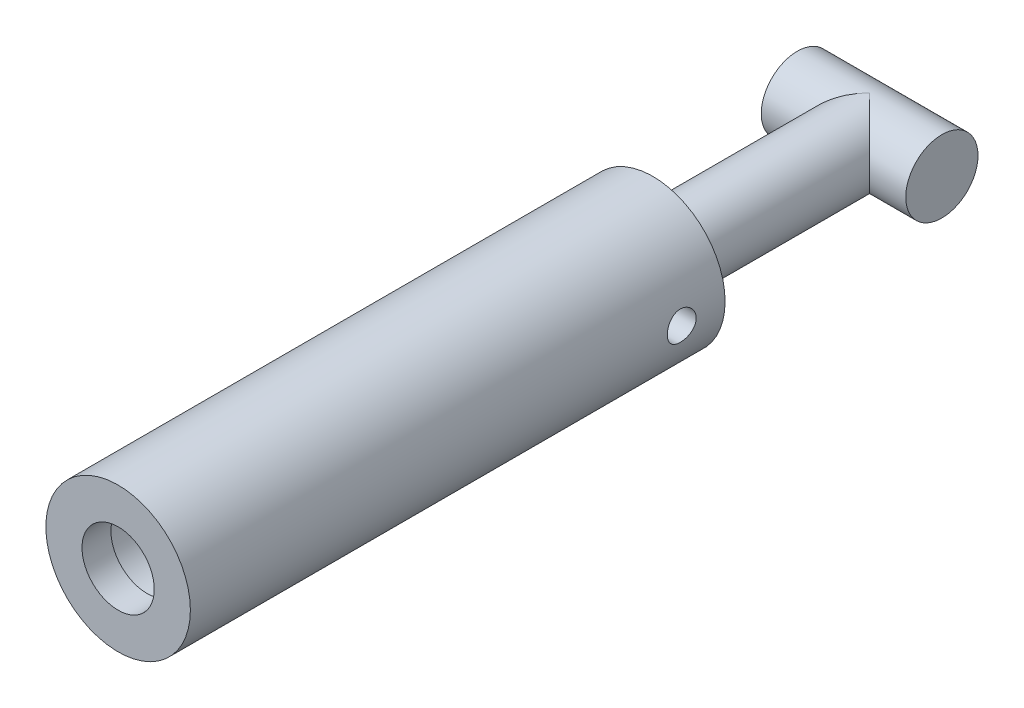
ISO-10303-21;
HEADER;
FILE_DESCRIPTION(('STEP AP214'),'2;1');
FILE_NAME('part.step','',(''),(''),'','','');
FILE_SCHEMA(('AUTOMOTIVE_DESIGN { 1 0 10303 214 1 1 1 1 }'));
ENDSEC;
DATA;
#1=APPLICATION_CONTEXT('core data for automotive mechanical design processes');
#2=APPLICATION_PROTOCOL_DEFINITION('international standard','automotive_design',2000,#1);
#3=PRODUCT_CONTEXT('',#1,'mechanical');
#4=PRODUCT('Part','Part','',(#3));
#5=PRODUCT_RELATED_PRODUCT_CATEGORY('part','',(#4));
#6=PRODUCT_DEFINITION_FORMATION('','',#4);
#7=PRODUCT_DEFINITION_CONTEXT('part definition',#1,'design');
#8=PRODUCT_DEFINITION('design','',#6,#7);
#9=PRODUCT_DEFINITION_SHAPE('','',#8);
#10=(LENGTH_UNIT() NAMED_UNIT(*) SI_UNIT(.MILLI.,.METRE.));
#11=(NAMED_UNIT(*) PLANE_ANGLE_UNIT() SI_UNIT($,.RADIAN.));
#12=(NAMED_UNIT(*) SI_UNIT($,.STERADIAN.) SOLID_ANGLE_UNIT());
#13=UNCERTAINTY_MEASURE_WITH_UNIT(LENGTH_MEASURE(1.E-05),#10,'distance_accuracy_value','');
#14=(GEOMETRIC_REPRESENTATION_CONTEXT(3) GLOBAL_UNCERTAINTY_ASSIGNED_CONTEXT((#13)) GLOBAL_UNIT_ASSIGNED_CONTEXT((#10,
#11,#12)) REPRESENTATION_CONTEXT('',''));
#15=CARTESIAN_POINT('',(0.,0.,0.));
#16=DIRECTION('',(0.,0.,1.));
#17=DIRECTION('',(1.,0.,0.));
#18=AXIS2_PLACEMENT_3D('',#15,#16,#17);
#19=CARTESIAN_POINT('',(0.,0.,0.));
#20=DIRECTION('',(0.,0.,1.));
#21=DIRECTION('',(1.,0.,0.));
#22=AXIS2_PLACEMENT_3D('',#19,#20,#21);
#23=PLANE('',#22);
#24=CARTESIAN_POINT('',(0.,0.,0.));
#25=DIRECTION('',(0.,0.,1.));
#26=DIRECTION('',(1.,0.,0.));
#27=AXIS2_PLACEMENT_3D('',#24,#25,#26);
#28=CIRCLE('',#27,5.);
#29=CARTESIAN_POINT('',(5.,0.,0.));
#30=VERTEX_POINT('',#29);
#31=EDGE_CURVE('E120',#30,#30,#28,.T.);
#32=ORIENTED_EDGE('',*,*,#31,.F.);
#33=EDGE_LOOP('',(#32));
#34=FACE_BOUND('',#33,.T.);
#35=CARTESIAN_POINT('',(0.,0.,0.));
#36=DIRECTION('',(0.,0.,1.));
#37=DIRECTION('',(1.,0.,0.));
#38=AXIS2_PLACEMENT_3D('',#35,#36,#37);
#39=CIRCLE('',#38,2.5);
#40=CARTESIAN_POINT('',(2.5,0.,0.));
#41=VERTEX_POINT('',#40);
#42=EDGE_CURVE('E12',#41,#41,#39,.F.);
#43=ORIENTED_EDGE('',*,*,#42,.F.);
#44=EDGE_LOOP('',(#43));
#45=FACE_BOUND('',#44,.T.);
#46=ADVANCED_FACE('F36',(#34,#45),#23,.F.);
#47=CARTESIAN_POINT('',(0.,0.,37.));
#48=DIRECTION('',(0.,0.,-1.));
#49=DIRECTION('',(-1.,0.,0.));
#50=AXIS2_PLACEMENT_3D('',#47,#48,#49);
#51=CYLINDRICAL_SURFACE('',#50,5.);
#52=CARTESIAN_POINT('',(-5.,0.,4.));
#53=CARTESIAN_POINT('',(-4.99999897580871,0.0555769067926332,3.99999795550165));
#54=CARTESIAN_POINT('',(-4.99906385178231,0.111179660201522,3.99535115703236));
#55=CARTESIAN_POINT('',(-4.99542365623231,0.220813507689019,3.97690149988476));
#56=CARTESIAN_POINT('',(-4.99271717860186,0.274843317541356,3.96309136719849));
#57=CARTESIAN_POINT('',(-4.98583649278287,0.379730305263313,3.92675872637921));
#58=CARTESIAN_POINT('',(-4.98166369076718,0.430590467933134,3.90424456315531));
#59=CARTESIAN_POINT('',(-4.97230398035314,0.527807988864226,3.85116775248871));
#60=CARTESIAN_POINT('',(-4.96711713235707,0.574165615075812,3.82060558439279));
#61=CARTESIAN_POINT('',(-4.9562216532997,0.661693477314865,3.75186150570857));
#62=CARTESIAN_POINT('',(-4.95050745504347,0.702793951158524,3.7135916446088));
#63=CARTESIAN_POINT('',(-4.93924180452588,0.778036756608028,3.6307075836083));
#64=CARTESIAN_POINT('',(-4.93369036500424,0.812178544770425,3.58609288866488));
#65=CARTESIAN_POINT('',(-4.92332441812615,0.87283175334762,3.49128380698812));
#66=CARTESIAN_POINT('',(-4.91851707364946,0.899270938865867,3.44104235620364));
#67=CARTESIAN_POINT('',(-4.91026268058418,0.943305666580308,3.33671818099592));
#68=CARTESIAN_POINT('',(-4.90681549761962,0.960902082437238,3.28263583665365));
#69=CARTESIAN_POINT('',(-4.90172805252204,0.986525299884828,3.17291563609208));
#70=CARTESIAN_POINT('',(-4.90006470107188,0.994674497958777,3.11730745585777));
#71=CARTESIAN_POINT('',(-4.89866375060627,1.00155212772612,3.00549017863566));
#72=CARTESIAN_POINT('',(-4.89892595467841,1.0002815227135,2.94928114367985));
#73=CARTESIAN_POINT('',(-4.90132551148185,0.988454573101819,2.838753211979));
#74=CARTESIAN_POINT('',(-4.90343452858763,0.978038540243906,2.78441859437269));
#75=CARTESIAN_POINT('',(-4.90924546160001,0.948437884623051,2.678283923337));
#76=CARTESIAN_POINT('',(-4.91294745357779,0.929252843100681,2.62648399108099));
#77=CARTESIAN_POINT('',(-4.92155618500408,0.88252478367472,2.5264847382964));
#78=CARTESIAN_POINT('',(-4.92647089813704,0.854926151232114,2.47831212043083));
#79=CARTESIAN_POINT('',(-4.93694618773062,0.792193574572679,2.38722915002719));
#80=CARTESIAN_POINT('',(-4.94250683838366,0.757058764356829,2.34431940314884));
#81=CARTESIAN_POINT('',(-4.95377021241462,0.679499934560584,2.26417059754306));
#82=CARTESIAN_POINT('',(-4.95947369210905,0.636956161212445,2.22704743214087));
#83=CARTESIAN_POINT('',(-4.97028848714408,0.54618502406201,2.16044615369878));
#84=CARTESIAN_POINT('',(-4.97539979488974,0.497957587379389,2.13096813870642));
#85=CARTESIAN_POINT('',(-4.98446690160887,0.397059386878921,2.08047249077402));
#86=CARTESIAN_POINT('',(-4.98842088848272,0.3443818195853,2.05946810635546));
#87=CARTESIAN_POINT('',(-4.99471408987858,0.236148976448665,2.02663952596143));
#88=CARTESIAN_POINT('',(-4.99705350000531,0.18059405007245,2.01481421792637));
#89=CARTESIAN_POINT('',(-4.99982671866868,0.0691794056271503,2.00084354620572));
#90=CARTESIAN_POINT('',(-5.0002917465247,0.0133403283255761,1.99853958045973));
#91=CARTESIAN_POINT('',(-4.99935051930103,-0.0979249341927142,2.00324985894218));
#92=CARTESIAN_POINT('',(-4.99794436941446,-0.153351142443793,2.0102635793526));
#93=CARTESIAN_POINT('',(-4.99343832008018,-0.261705659946541,2.03327837354396));
#94=CARTESIAN_POINT('',(-4.99035376404206,-0.314651948339903,2.0491980684979));
#95=CARTESIAN_POINT('',(-4.98283552061033,-0.417123627499667,2.08948398265581));
#96=CARTESIAN_POINT('',(-4.97840173214227,-0.46664876163754,2.11385083467683));
#97=CARTESIAN_POINT('',(-4.96859911533294,-0.561541173686218,2.17068249065131));
#98=CARTESIAN_POINT('',(-4.96321950437052,-0.606850126752188,2.20324278103895));
#99=CARTESIAN_POINT('',(-4.95214734829882,-0.691418019119207,2.27540919120728));
#100=CARTESIAN_POINT('',(-4.94645476968388,-0.730676308930763,2.31501606639987));
#101=CARTESIAN_POINT('',(-4.93529303556965,-0.802640590774176,2.40087335189112));
#102=CARTESIAN_POINT('',(-4.92982860233304,-0.835237702448655,2.44721574422134));
#103=CARTESIAN_POINT('',(-4.91984191796194,-0.892185420051206,2.54481136135668));
#104=CARTESIAN_POINT('',(-4.91531962913342,-0.916536355922903,2.59606438957355));
#105=CARTESIAN_POINT('',(-4.90776740584383,-0.95615184158196,2.70176824614955));
#106=CARTESIAN_POINT('',(-4.90472974872187,-0.971463499791051,2.75620084121032));
#107=CARTESIAN_POINT('',(-4.90047436792025,-0.992708651627196,2.8669334534909));
#108=CARTESIAN_POINT('',(-4.89925640691111,-0.998643368225113,2.92323322620935));
#109=CARTESIAN_POINT('',(-4.89879149631379,-1.00092091086747,3.03500886454432));
#110=CARTESIAN_POINT('',(-4.89950919189301,-0.997435788070896,3.09048114892701));
#111=CARTESIAN_POINT('',(-4.90275573484614,-0.981352304100061,3.20003164990503));
#112=CARTESIAN_POINT('',(-4.90528456767169,-0.968754016129298,3.2541098776948));
#113=CARTESIAN_POINT('',(-4.91185264219159,-0.934878568498954,3.35922771124054));
#114=CARTESIAN_POINT('',(-4.91588821018831,-0.913622506717345,3.41027436050242));
#115=CARTESIAN_POINT('',(-4.9250171497417,-0.863054644601604,3.50810372073444));
#116=CARTESIAN_POINT('',(-4.93011060998894,-0.833742168774882,3.55488607372514));
#117=CARTESIAN_POINT('',(-4.94088960523225,-0.767305914786414,3.64371557215031));
#118=CARTESIAN_POINT('',(-4.94658372909699,-0.73005788723518,3.6856687652676));
#119=CARTESIAN_POINT('',(-4.95786081871955,-0.64906436901314,3.76278620552917));
#120=CARTESIAN_POINT('',(-4.96344375863184,-0.605317387153335,3.79794889031727));
#121=CARTESIAN_POINT('',(-4.97393832387971,-0.512017629088246,3.86083464394645));
#122=CARTESIAN_POINT('',(-4.97884231219246,-0.462408884429834,3.88847600328003));
#123=CARTESIAN_POINT('',(-4.98735125085,-0.359166360940732,3.93498612259659));
#124=CARTESIAN_POINT('',(-4.99095737138616,-0.305536260863126,3.95386278953249));
#125=CARTESIAN_POINT('',(-4.99576372595371,-0.209821488923779,3.97865194804472));
#126=CARTESIAN_POINT('',(-4.99734303158452,-0.168281664013784,3.98664319370776));
#127=CARTESIAN_POINT('',(-4.99946154139893,-0.0844995252100669,3.99731791235836));
#128=CARTESIAN_POINT('',(-5.00000077873155,-0.042257233748619,4.00000155450977));
#129=CARTESIAN_POINT('',(-5.,0.,4.));
#130=B_SPLINE_CURVE_WITH_KNOTS('',3,(#52,#53,#54,#55,#56,#57,#58,#59,#60,#61,#62,#63,#64,#65,
#66,#67,#68,#69,#70,#71,#72,#73,#74,#75,#76,#77,#78,#79,#80,#81,#82,#83,#84,#85,#86,#87,#88,#89,
#90,#91,#92,#93,#94,#95,#96,#97,#98,#99,#100,#101,#102,#103,#104,#105,#106,#107,#108,#109,#110,
#111,#112,#113,#114,#115,#116,#117,#118,#119,#120,#121,#122,#123,#124,#125,#126,#127,#128,#129),
.UNSPECIFIED.,.T.,.F.,(4,2,2,2,2,2,2,2,2,2,2,2,2,2,2,2,2,2,2,2,2,2,2,2,2,2,2,2,2,2,2,2,2,2,2,2,
2,2,4),(0.,0.166576130661259,0.333284650691323,0.499833735250342,0.666372902230863,
0.834932670112186,1.00350559674737,1.17361195005923,1.34370149365198,1.51156185103587,
1.67940504281225,1.84471727006278,2.0100373925373,2.17647490203593,2.3429315474967,
2.51238252491351,2.6818356753982,2.85155274854024,3.02124925698036,3.18810735676265,
3.35495607657868,3.52030453950723,3.68566539216022,3.85305066033359,4.0204538834593,
4.19040628579226,4.36035188723467,4.52940381032723,4.69843368330415,4.86439722567702,
5.03035943492609,5.1959196125311,5.36149367581867,5.52988076239143,5.69830654532931,
5.86849496675637,6.03852955517519,6.16518775289894,6.29184191370996),.UNSPECIFIED.);
#131=CARTESIAN_POINT('',(-5.,0.,4.));
#132=VERTEX_POINT('',#131);
#133=EDGE_CURVE('E98',#132,#132,#130,.T.);
#134=ORIENTED_EDGE('',*,*,#133,.F.);
#135=EDGE_LOOP('',(#134));
#136=FACE_BOUND('',#135,.T.);
#137=CARTESIAN_POINT('',(0.,0.,37.));
#138=DIRECTION('',(0.,0.,1.));
#139=DIRECTION('',(1.,0.,0.));
#140=AXIS2_PLACEMENT_3D('',#137,#138,#139);
#141=CIRCLE('',#140,5.);
#142=CARTESIAN_POINT('',(5.,0.,37.));
#143=VERTEX_POINT('',#142);
#144=EDGE_CURVE('E45',#143,#143,#141,.T.);
#145=ORIENTED_EDGE('',*,*,#144,.F.);
#146=EDGE_LOOP('',(#145));
#147=FACE_BOUND('',#146,.T.);
#148=ORIENTED_EDGE('',*,*,#31,.T.);
#149=EDGE_LOOP('',(#148));
#150=FACE_BOUND('',#149,.T.);
#151=CARTESIAN_POINT('',(5.,0.,4.));
#152=CARTESIAN_POINT('',(4.99999897580871,-0.0555769067926332,3.99999795550165));
#153=CARTESIAN_POINT('',(4.99906385178231,-0.111179660201522,3.99535115703236));
#154=CARTESIAN_POINT('',(4.99542365623231,-0.220813507689019,3.97690149988476));
#155=CARTESIAN_POINT('',(4.99271717860186,-0.274843317541356,3.96309136719849));
#156=CARTESIAN_POINT('',(4.98583649278287,-0.379730305263313,3.92675872637921));
#157=CARTESIAN_POINT('',(4.98166369076718,-0.430590467933134,3.90424456315531));
#158=CARTESIAN_POINT('',(4.97230398035314,-0.527807988864226,3.85116775248871));
#159=CARTESIAN_POINT('',(4.96711713235707,-0.574165615075812,3.82060558439279));
#160=CARTESIAN_POINT('',(4.9562216532997,-0.661693477314865,3.75186150570857));
#161=CARTESIAN_POINT('',(4.95050745504347,-0.702793951158524,3.7135916446088));
#162=CARTESIAN_POINT('',(4.93924180452588,-0.778036756608028,3.6307075836083));
#163=CARTESIAN_POINT('',(4.93369036500424,-0.812178544770425,3.58609288866488));
#164=CARTESIAN_POINT('',(4.92332441812615,-0.87283175334762,3.49128380698812));
#165=CARTESIAN_POINT('',(4.91851707364946,-0.899270938865867,3.44104235620364));
#166=CARTESIAN_POINT('',(4.91026268058418,-0.943305666580308,3.33671818099592));
#167=CARTESIAN_POINT('',(4.90681549761962,-0.960902082437238,3.28263583665365));
#168=CARTESIAN_POINT('',(4.90172805252204,-0.986525299884828,3.17291563609208));
#169=CARTESIAN_POINT('',(4.90006470107188,-0.994674497958777,3.11730745585777));
#170=CARTESIAN_POINT('',(4.89866375060627,-1.00155212772612,3.00549017863566));
#171=CARTESIAN_POINT('',(4.89892595467841,-1.0002815227135,2.94928114367985));
#172=CARTESIAN_POINT('',(4.90132551148185,-0.988454573101819,2.838753211979));
#173=CARTESIAN_POINT('',(4.90343452858763,-0.978038540243906,2.78441859437269));
#174=CARTESIAN_POINT('',(4.90924546160001,-0.948437884623051,2.678283923337));
#175=CARTESIAN_POINT('',(4.91294745357779,-0.929252843100681,2.62648399108099));
#176=CARTESIAN_POINT('',(4.92155618500408,-0.88252478367472,2.5264847382964));
#177=CARTESIAN_POINT('',(4.92647089813704,-0.854926151232114,2.47831212043083));
#178=CARTESIAN_POINT('',(4.93694618773062,-0.792193574572679,2.38722915002719));
#179=CARTESIAN_POINT('',(4.94250683838366,-0.757058764356829,2.34431940314884));
#180=CARTESIAN_POINT('',(4.95377021241462,-0.679499934560584,2.26417059754306));
#181=CARTESIAN_POINT('',(4.95947369210905,-0.636956161212445,2.22704743214087));
#182=CARTESIAN_POINT('',(4.97028848714408,-0.54618502406201,2.16044615369878));
#183=CARTESIAN_POINT('',(4.97539979488974,-0.497957587379389,2.13096813870642));
#184=CARTESIAN_POINT('',(4.98446690160887,-0.397059386878921,2.08047249077402));
#185=CARTESIAN_POINT('',(4.98842088848272,-0.3443818195853,2.05946810635546));
#186=CARTESIAN_POINT('',(4.99471408987858,-0.236148976448665,2.02663952596143));
#187=CARTESIAN_POINT('',(4.99705350000531,-0.18059405007245,2.01481421792637));
#188=CARTESIAN_POINT('',(4.99982671866868,-0.0691794056271503,2.00084354620572));
#189=CARTESIAN_POINT('',(5.0002917465247,-0.0133403283255761,1.99853958045973));
#190=CARTESIAN_POINT('',(4.99935051930103,0.0979249341927142,2.00324985894218));
#191=CARTESIAN_POINT('',(4.99794436941446,0.153351142443793,2.0102635793526));
#192=CARTESIAN_POINT('',(4.99343832008018,0.261705659946541,2.03327837354396));
#193=CARTESIAN_POINT('',(4.99035376404206,0.314651948339903,2.0491980684979));
#194=CARTESIAN_POINT('',(4.98283552061033,0.417123627499667,2.08948398265581));
#195=CARTESIAN_POINT('',(4.97840173214227,0.46664876163754,2.11385083467683));
#196=CARTESIAN_POINT('',(4.96859911533294,0.561541173686218,2.17068249065131));
#197=CARTESIAN_POINT('',(4.96321950437052,0.606850126752188,2.20324278103895));
#198=CARTESIAN_POINT('',(4.95214734829882,0.691418019119207,2.27540919120728));
#199=CARTESIAN_POINT('',(4.94645476968388,0.730676308930763,2.31501606639987));
#200=CARTESIAN_POINT('',(4.93529303556965,0.802640590774176,2.40087335189112));
#201=CARTESIAN_POINT('',(4.92982860233304,0.835237702448655,2.44721574422134));
#202=CARTESIAN_POINT('',(4.91984191796194,0.892185420051206,2.54481136135668));
#203=CARTESIAN_POINT('',(4.91531962913342,0.916536355922903,2.59606438957355));
#204=CARTESIAN_POINT('',(4.90776740584383,0.95615184158196,2.70176824614955));
#205=CARTESIAN_POINT('',(4.90472974872187,0.971463499791051,2.75620084121032));
#206=CARTESIAN_POINT('',(4.90047436792025,0.992708651627196,2.8669334534909));
#207=CARTESIAN_POINT('',(4.89925640691111,0.998643368225113,2.92323322620935));
#208=CARTESIAN_POINT('',(4.89879149631379,1.00092091086747,3.03500886454432));
#209=CARTESIAN_POINT('',(4.89950919189301,0.997435788070896,3.09048114892701));
#210=CARTESIAN_POINT('',(4.90275573484614,0.981352304100061,3.20003164990503));
#211=CARTESIAN_POINT('',(4.90528456767169,0.968754016129298,3.2541098776948));
#212=CARTESIAN_POINT('',(4.91185264219159,0.934878568498954,3.35922771124054));
#213=CARTESIAN_POINT('',(4.91588821018831,0.913622506717345,3.41027436050242));
#214=CARTESIAN_POINT('',(4.9250171497417,0.863054644601604,3.50810372073444));
#215=CARTESIAN_POINT('',(4.93011060998894,0.833742168774882,3.55488607372514));
#216=CARTESIAN_POINT('',(4.94088960523225,0.767305914786414,3.64371557215031));
#217=CARTESIAN_POINT('',(4.94658372909699,0.73005788723518,3.6856687652676));
#218=CARTESIAN_POINT('',(4.95786081871955,0.64906436901314,3.76278620552917));
#219=CARTESIAN_POINT('',(4.96344375863184,0.605317387153335,3.79794889031727));
#220=CARTESIAN_POINT('',(4.97393832387971,0.512017629088246,3.86083464394645));
#221=CARTESIAN_POINT('',(4.97884231219246,0.462408884429834,3.88847600328003));
#222=CARTESIAN_POINT('',(4.98735125085,0.359166360940732,3.93498612259659));
#223=CARTESIAN_POINT('',(4.99095737138616,0.305536260863126,3.95386278953249));
#224=CARTESIAN_POINT('',(4.99576372595371,0.209821488923779,3.97865194804472));
#225=CARTESIAN_POINT('',(4.99734303158452,0.168281664013784,3.98664319370776));
#226=CARTESIAN_POINT('',(4.99946154139893,0.0844995252100669,3.99731791235836));
#227=CARTESIAN_POINT('',(5.00000077873155,0.042257233748619,4.00000155450977));
#228=CARTESIAN_POINT('',(5.,0.,4.));
#229=B_SPLINE_CURVE_WITH_KNOTS('',3,(#151,#152,#153,#154,#155,#156,#157,#158,#159,#160,#161,
#162,#163,#164,#165,#166,#167,#168,#169,#170,#171,#172,#173,#174,#175,#176,#177,#178,#179,#180,
#181,#182,#183,#184,#185,#186,#187,#188,#189,#190,#191,#192,#193,#194,#195,#196,#197,#198,#199,
#200,#201,#202,#203,#204,#205,#206,#207,#208,#209,#210,#211,#212,#213,#214,#215,#216,#217,#218,
#219,#220,#221,#222,#223,#224,#225,#226,#227,#228),.UNSPECIFIED.,.T.,.F.,(4,2,2,2,2,2,2,2,2,2,2,
2,2,2,2,2,2,2,2,2,2,2,2,2,2,2,2,2,2,2,2,2,2,2,2,2,2,2,4),(0.,0.166576130661259,
0.333284650691323,0.499833735250342,0.666372902230863,0.834932670112186,1.00350559674737,
1.17361195005923,1.34370149365198,1.51156185103587,1.67940504281225,1.84471727006278,
2.0100373925373,2.17647490203593,2.3429315474967,2.51238252491351,2.6818356753982,
2.85155274854024,3.02124925698036,3.18810735676265,3.35495607657868,3.52030453950723,
3.68566539216022,3.85305066033359,4.0204538834593,4.19040628579226,4.36035188723467,
4.52940381032723,4.69843368330415,4.86439722567702,5.03035943492609,5.1959196125311,
5.36149367581867,5.52988076239143,5.69830654532931,5.86849496675637,6.03852955517519,
6.16518775289894,6.29184191370996),.UNSPECIFIED.);
#230=CARTESIAN_POINT('',(5.,0.,4.));
#231=VERTEX_POINT('',#230);
#232=EDGE_CURVE('E102',#231,#231,#229,.T.);
#233=ORIENTED_EDGE('',*,*,#232,.F.);
#234=EDGE_LOOP('',(#233));
#235=FACE_BOUND('',#234,.T.);
#236=ADVANCED_FACE('F38',(#136,#147,#150,#235),#51,.T.);
#237=CARTESIAN_POINT('',(0.,0.,1.99999999999999));
#238=DIRECTION('',(0.,0.,1.));
#239=DIRECTION('',(1.,0.,0.));
#240=AXIS2_PLACEMENT_3D('',#237,#238,#239);
#241=CYLINDRICAL_SURFACE('',#240,3.);
#242=CARTESIAN_POINT('',(0.,0.,35.));
#243=DIRECTION('',(0.,0.,1.));
#244=DIRECTION('',(1.,0.,0.));
#245=AXIS2_PLACEMENT_3D('',#242,#243,#244);
#246=CIRCLE('',#245,3.);
#247=CARTESIAN_POINT('',(3.,0.,35.));
#248=VERTEX_POINT('',#247);
#249=EDGE_CURVE('E107',#248,#248,#246,.T.);
#250=ORIENTED_EDGE('',*,*,#249,.T.);
#251=EDGE_LOOP('',(#250));
#252=FACE_BOUND('',#251,.T.);
#253=CARTESIAN_POINT('',(0.,0.,1.99999999999999));
#254=DIRECTION('',(0.,0.,1.));
#255=DIRECTION('',(1.,0.,0.));
#256=AXIS2_PLACEMENT_3D('',#253,#254,#255);
#257=CIRCLE('',#256,3.);
#258=CARTESIAN_POINT('',(3.,0.,1.99999999999999));
#259=VERTEX_POINT('',#258);
#260=CARTESIAN_POINT('',(-3.,0.,1.99999999999999));
#261=VERTEX_POINT('',#260);
#262=EDGE_CURVE('E108',#259,#261,#257,.T.);
#263=ORIENTED_EDGE('',*,*,#262,.F.);
#264=CARTESIAN_POINT('',(3.,0.,2.));
#265=CARTESIAN_POINT('',(3.00000015300943,-0.0545633628867233,1.99999974626836));
#266=CARTESIAN_POINT('',(2.99849769507545,-0.10912519453855,2.00448026612722));
#267=CARTESIAN_POINT('',(2.99265210203281,-0.216641760872972,2.02222910881722));
#268=CARTESIAN_POINT('',(2.98830867202153,-0.269596328118818,2.03549834394892));
#269=CARTESIAN_POINT('',(2.97725307906443,-0.372332789501776,2.07031924338405));
#270=CARTESIAN_POINT('',(2.97054487730853,-0.422119825886034,2.09185706245927));
#271=CARTESIAN_POINT('',(2.95544445717342,-0.517374936805325,2.14254117283835));
#272=CARTESIAN_POINT('',(2.94705190667778,-0.562842156958706,2.1716889650026));
#273=CARTESIAN_POINT('',(2.92914094443005,-0.649741675022266,2.23782580485875));
#274=CARTESIAN_POINT('',(2.91959556463785,-0.691003700298309,2.27503123426049));
#275=CARTESIAN_POINT('',(2.90060314783122,-0.766832692702084,2.35576715470657));
#276=CARTESIAN_POINT('',(2.89115613290549,-0.801398185489463,2.39929903492851));
#277=CARTESIAN_POINT('',(2.87313332477274,-0.863824942227859,2.49298511519646));
#278=CARTESIAN_POINT('',(2.86459039275688,-0.891464858221032,2.54329373973212));
#279=CARTESIAN_POINT('',(2.84975305418601,-0.937818873877721,2.64817609445855));
#280=CARTESIAN_POINT('',(2.84345796160746,-0.956535697386765,2.70274851716274));
#281=CARTESIAN_POINT('',(2.83411303269377,-0.983873461509163,2.81267322149671));
#282=CARTESIAN_POINT('',(2.83096095769611,-0.992813448271769,2.86793720848906));
#283=CARTESIAN_POINT('',(2.82795656629508,-1.00134112333448,2.97926375415588));
#284=CARTESIAN_POINT('',(2.8281032302273,-1.00093170160472,3.03532606070919));
#285=CARTESIAN_POINT('',(2.8315901500818,-0.991019903703419,3.14393663044402));
#286=CARTESIAN_POINT('',(2.83478415867533,-0.981933913166995,3.19652840291902));
#287=CARTESIAN_POINT('',(2.84376657724551,-0.955606162849417,3.29939341960683));
#288=CARTESIAN_POINT('',(2.84955529784108,-0.938363426591871,3.34966638543507));
#289=CARTESIAN_POINT('',(2.86317911131249,-0.895939058060211,3.44741274959148));
#290=CARTESIAN_POINT('',(2.87104565793117,-0.870634048707263,3.49482802546953));
#291=CARTESIAN_POINT('',(2.88792558575726,-0.812889106303139,3.58487090827973));
#292=CARTESIAN_POINT('',(2.89693929790464,-0.780447112364006,3.62749712693338));
#293=CARTESIAN_POINT('',(2.91567329167741,-0.707349332682237,3.70909159816077));
#294=CARTESIAN_POINT('',(2.92540589354843,-0.666353150076311,3.74775269450907));
#295=CARTESIAN_POINT('',(2.94406938387037,-0.578339569970064,3.8177312666634));
#296=CARTESIAN_POINT('',(2.95300019538067,-0.531321595660814,3.8490480381645));
#297=CARTESIAN_POINT('',(2.96917107937794,-0.431947613046268,3.90369630023507));
#298=CARTESIAN_POINT('',(2.97639350008039,-0.379543276416337,3.92694549134073));
#299=CARTESIAN_POINT('',(2.98820567144435,-0.271269083364508,3.96420317395571));
#300=CARTESIAN_POINT('',(2.99279633654879,-0.215400438154954,3.97821487542344));
#301=CARTESIAN_POINT('',(2.99867627071441,-0.104383829529304,3.99605566602236));
#302=CARTESIAN_POINT('',(3.00010001833731,-0.0493095998648457,4.00029980917275));
#303=CARTESIAN_POINT('',(2.99988902694825,0.0607750699602362,3.99966732640153));
#304=CARTESIAN_POINT('',(2.99825480419352,0.115785519319647,3.99479224002013));
#305=CARTESIAN_POINT('',(2.99220024717114,0.222519866304259,3.97638809226403));
#306=CARTESIAN_POINT('',(2.98786198711228,0.274292806834856,3.96311379395048));
#307=CARTESIAN_POINT('',(2.97691846830034,0.374855958579561,3.9286065555333));
#308=CARTESIAN_POINT('',(2.97031292046541,0.423645788508559,3.90737260053233));
#309=CARTESIAN_POINT('',(2.95528931287427,0.518288296393321,3.8569295681591));
#310=CARTESIAN_POINT('',(2.94682814756305,0.564029959217329,3.8275254067164));
#311=CARTESIAN_POINT('',(2.92905253915743,0.650064830135404,3.76180584998695));
#312=CARTESIAN_POINT('',(2.91973783591888,0.690356367794894,3.72548834396984));
#313=CARTESIAN_POINT('',(2.90076847982472,0.766252507807014,3.64502124899174));
#314=CARTESIAN_POINT('',(2.89111761095155,0.801560969248492,3.60059077306675));
#315=CARTESIAN_POINT('',(2.87299973286981,0.864257522320854,3.5062284321955));
#316=CARTESIAN_POINT('',(2.8645327335312,0.891645547920843,3.4562965213898));
#317=CARTESIAN_POINT('',(2.84982391820308,0.937596930423361,3.35232698469341));
#318=CARTESIAN_POINT('',(2.84357760900632,0.956178132197766,3.29829792075722));
#319=CARTESIAN_POINT('',(2.83410832399133,0.983894666792163,3.18762134987585));
#320=CARTESIAN_POINT('',(2.83088398622698,0.993034254961244,3.13097503456694));
#321=CARTESIAN_POINT('',(2.82797858875071,1.00127628247038,3.01980290398679));
#322=CARTESIAN_POINT('',(2.82812400344299,1.00087025731093,2.96531765974826));
#323=CARTESIAN_POINT('',(2.8315126992356,0.991242293454878,2.85723492510026));
#324=CARTESIAN_POINT('',(2.83475579595884,0.982020879458887,2.80363738204709));
#325=CARTESIAN_POINT('',(2.84384524278943,0.955371813126981,2.69986433698733));
#326=CARTESIAN_POINT('',(2.84964098015514,0.93810334601488,2.64964317499277));
#327=CARTESIAN_POINT('',(2.86316398825434,0.895979365760382,2.55277259306447));
#328=CARTESIAN_POINT('',(2.87089168765297,0.871122168553979,2.50612396881274));
#329=CARTESIAN_POINT('',(2.8878282922406,0.813260692583249,2.41551633007631));
#330=CARTESIAN_POINT('',(2.89708711641604,0.779948242764532,2.37176349810141));
#331=CARTESIAN_POINT('',(2.91583356283786,0.706642883135698,2.29031018661601));
#332=CARTESIAN_POINT('',(2.92532124912518,0.666648084451495,2.25261142431198));
#333=CARTESIAN_POINT('',(2.94390030525393,0.579241556920675,2.18285558771076));
#334=CARTESIAN_POINT('',(2.95296181801216,0.531601513499725,2.15107565224898));
#335=CARTESIAN_POINT('',(2.96925991172652,0.431357357406629,2.09600957114937));
#336=CARTESIAN_POINT('',(2.9764969590794,0.37875451813235,2.07272125407796));
#337=CARTESIAN_POINT('',(2.98805515068532,0.272493647200975,2.03627836751132));
#338=CARTESIAN_POINT('',(2.9924921242252,0.218987757676409,2.02271753373662));
#339=CARTESIAN_POINT('',(2.99846407064225,0.110320416010247,2.00457971932288));
#340=CARTESIAN_POINT('',(2.99999984531906,0.0551594255687465,2.00000025650346));
#341=CARTESIAN_POINT('',(3.,0.,2.));
#342=B_SPLINE_CURVE_WITH_KNOTS('',3,(#264,#265,#266,#267,#268,#269,#270,#271,#272,#273,#274,
#275,#276,#277,#278,#279,#280,#281,#282,#283,#284,#285,#286,#287,#288,#289,#290,#291,#292,#293,
#294,#295,#296,#297,#298,#299,#300,#301,#302,#303,#304,#305,#306,#307,#308,#309,#310,#311,#312,
#313,#314,#315,#316,#317,#318,#319,#320,#321,#322,#323,#324,#325,#326,#327,#328,#329,#330,#331,
#332,#333,#334,#335,#336,#337,#338,#339,#340,#341),.UNSPECIFIED.,.T.,.F.,(4,2,2,2,2,2,2,2,2,2,2,
2,2,2,2,2,2,2,2,2,2,2,2,2,2,2,2,2,2,2,2,2,2,2,2,2,2,2,4),(0.,0.163487106026011,
0.326991185267521,0.490222672870274,0.6534863777991,0.82184684282756,0.990244332875302,
1.1634838482347,1.33667044692833,1.5040192574184,1.67131633987485,1.8309682655128,
1.99063930855482,2.15288171155131,2.31517102558207,2.48593305811367,2.65671145966618,
2.82918405650358,3.00159668877208,3.1665358317517,3.33144713164177,3.49158157978214,
3.65173645284104,3.81610399843737,3.98052180821891,4.15241022880752,4.32430008234997,
4.49584013824416,4.66730284700846,4.82995666056619,4.99260079341185,5.15215587070228,
5.31174638165788,5.47830066681615,5.64490211113589,5.81799660824911,5.99104681142266,
6.15636558363624,6.3216386602795),.UNSPECIFIED.);
#343=EDGE_CURVE('E70',#259,#259,#342,.T.);
#344=ORIENTED_EDGE('',*,*,#343,.F.);
#345=EDGE_CURVE('E112',#261,#259,#257,.T.);
#346=ORIENTED_EDGE('',*,*,#345,.F.);
#347=CARTESIAN_POINT('',(-3.,0.,1.99999999999999));
#348=CARTESIAN_POINT('',(-3.00000015300943,0.0545633628867231,1.99999974626835));
#349=CARTESIAN_POINT('',(-2.99849769507545,0.10912519453855,2.00448026612722));
#350=CARTESIAN_POINT('',(-2.99265210203281,0.216641760872972,2.02222910881722));
#351=CARTESIAN_POINT('',(-2.98830867202153,0.269596328118818,2.03549834394892));
#352=CARTESIAN_POINT('',(-2.97725307906443,0.372332789501776,2.07031924338405));
#353=CARTESIAN_POINT('',(-2.97054487730853,0.422119825886035,2.09185706245927));
#354=CARTESIAN_POINT('',(-2.95544445717342,0.517374936805325,2.14254117283835));
#355=CARTESIAN_POINT('',(-2.94705190667778,0.562842156958706,2.1716889650026));
#356=CARTESIAN_POINT('',(-2.92914094443005,0.649741675022267,2.23782580485875));
#357=CARTESIAN_POINT('',(-2.91959556463785,0.69100370029831,2.27503123426049));
#358=CARTESIAN_POINT('',(-2.90060314783122,0.766832692702084,2.35576715470657));
#359=CARTESIAN_POINT('',(-2.89115613290549,0.801398185489463,2.39929903492851));
#360=CARTESIAN_POINT('',(-2.87313332477274,0.863824942227859,2.49298511519646));
#361=CARTESIAN_POINT('',(-2.86459039275688,0.891464858221032,2.54329373973212));
#362=CARTESIAN_POINT('',(-2.84975305418601,0.937818873877722,2.64817609445855));
#363=CARTESIAN_POINT('',(-2.84345796160746,0.956535697386765,2.70274851716274));
#364=CARTESIAN_POINT('',(-2.83411303269377,0.983873461509164,2.81267322149671));
#365=CARTESIAN_POINT('',(-2.83096095769611,0.992813448271769,2.86793720848906));
#366=CARTESIAN_POINT('',(-2.82795656629508,1.00134112333448,2.97926375415588));
#367=CARTESIAN_POINT('',(-2.8281032302273,1.00093170160472,3.03532606070919));
#368=CARTESIAN_POINT('',(-2.8315901500818,0.991019903703419,3.14393663044402));
#369=CARTESIAN_POINT('',(-2.83478415867533,0.981933913166995,3.19652840291902));
#370=CARTESIAN_POINT('',(-2.84376657724551,0.955606162849417,3.29939341960684));
#371=CARTESIAN_POINT('',(-2.84955529784108,0.938363426591871,3.34966638543507));
#372=CARTESIAN_POINT('',(-2.86317911131249,0.895939058060211,3.44741274959148));
#373=CARTESIAN_POINT('',(-2.87104565793117,0.870634048707263,3.49482802546953));
#374=CARTESIAN_POINT('',(-2.88792558575726,0.812889106303139,3.58487090827973));
#375=CARTESIAN_POINT('',(-2.89693929790464,0.780447112364005,3.62749712693338));
#376=CARTESIAN_POINT('',(-2.91567329167741,0.707349332682237,3.70909159816077));
#377=CARTESIAN_POINT('',(-2.92540589354843,0.666353150076311,3.74775269450907));
#378=CARTESIAN_POINT('',(-2.94406938387037,0.578339569970064,3.8177312666634));
#379=CARTESIAN_POINT('',(-2.95300019538067,0.531321595660814,3.8490480381645));
#380=CARTESIAN_POINT('',(-2.96917107937794,0.431947613046267,3.90369630023507));
#381=CARTESIAN_POINT('',(-2.97639350008039,0.379543276416336,3.92694549134073));
#382=CARTESIAN_POINT('',(-2.98820567144435,0.271269083364507,3.96420317395571));
#383=CARTESIAN_POINT('',(-2.99279633654879,0.215400438154953,3.97821487542344));
#384=CARTESIAN_POINT('',(-2.99867627071441,0.104383829529303,3.99605566602236));
#385=CARTESIAN_POINT('',(-3.00010001833731,0.0493095998648444,4.00029980917275));
#386=CARTESIAN_POINT('',(-2.99988902694825,-0.0607750699602372,3.99966732640153));
#387=CARTESIAN_POINT('',(-2.99825480419352,-0.115785519319648,3.99479224002013));
#388=CARTESIAN_POINT('',(-2.99220024717114,-0.22251986630426,3.97638809226403));
#389=CARTESIAN_POINT('',(-2.98786198711228,-0.274292806834857,3.96311379395048));
#390=CARTESIAN_POINT('',(-2.97691846830034,-0.374855958579561,3.9286065555333));
#391=CARTESIAN_POINT('',(-2.97031292046541,-0.42364578850856,3.90737260053233));
#392=CARTESIAN_POINT('',(-2.95528931287427,-0.518288296393322,3.8569295681591));
#393=CARTESIAN_POINT('',(-2.94682814756305,-0.56402995921733,3.8275254067164));
#394=CARTESIAN_POINT('',(-2.92905253915743,-0.650064830135404,3.76180584998695));
#395=CARTESIAN_POINT('',(-2.91973783591888,-0.690356367794894,3.72548834396984));
#396=CARTESIAN_POINT('',(-2.90076847982472,-0.766252507807014,3.64502124899174));
#397=CARTESIAN_POINT('',(-2.89111761095155,-0.801560969248492,3.60059077306675));
#398=CARTESIAN_POINT('',(-2.87299973286981,-0.864257522320854,3.5062284321955));
#399=CARTESIAN_POINT('',(-2.8645327335312,-0.891645547920844,3.4562965213898));
#400=CARTESIAN_POINT('',(-2.84982391820308,-0.937596930423361,3.35232698469341));
#401=CARTESIAN_POINT('',(-2.84357760900632,-0.956178132197766,3.29829792075722));
#402=CARTESIAN_POINT('',(-2.83410832399133,-0.983894666792163,3.18762134987585));
#403=CARTESIAN_POINT('',(-2.83088398622698,-0.993034254961244,3.13097503456694));
#404=CARTESIAN_POINT('',(-2.82797858875071,-1.00127628247038,3.01980290398679));
#405=CARTESIAN_POINT('',(-2.82812400344299,-1.00087025731093,2.96531765974826));
#406=CARTESIAN_POINT('',(-2.8315126992356,-0.991242293454878,2.85723492510026));
#407=CARTESIAN_POINT('',(-2.83475579595884,-0.982020879458887,2.80363738204709));
#408=CARTESIAN_POINT('',(-2.84384524278943,-0.95537181312698,2.69986433698733));
#409=CARTESIAN_POINT('',(-2.84964098015514,-0.93810334601488,2.64964317499277));
#410=CARTESIAN_POINT('',(-2.86316398825434,-0.895979365760382,2.55277259306447));
#411=CARTESIAN_POINT('',(-2.87089168765297,-0.871122168553979,2.50612396881274));
#412=CARTESIAN_POINT('',(-2.8878282922406,-0.813260692583249,2.41551633007631));
#413=CARTESIAN_POINT('',(-2.89708711641604,-0.779948242764531,2.3717634981014));
#414=CARTESIAN_POINT('',(-2.91583356283786,-0.706642883135696,2.29031018661601));
#415=CARTESIAN_POINT('',(-2.92532124912518,-0.666648084451494,2.25261142431198));
#416=CARTESIAN_POINT('',(-2.94390030525393,-0.579241556920674,2.18285558771076));
#417=CARTESIAN_POINT('',(-2.95296181801216,-0.531601513499725,2.15107565224898));
#418=CARTESIAN_POINT('',(-2.96925991172652,-0.431357357406629,2.09600957114937));
#419=CARTESIAN_POINT('',(-2.9764969590794,-0.378754518132349,2.07272125407796));
#420=CARTESIAN_POINT('',(-2.98805515068532,-0.272493647200975,2.03627836751132));
#421=CARTESIAN_POINT('',(-2.9924921242252,-0.218987757676408,2.02271753373662));
#422=CARTESIAN_POINT('',(-2.99846407064225,-0.110320416010247,2.00457971932287));
#423=CARTESIAN_POINT('',(-2.99999984531906,-0.0551594255687462,2.00000025650346));
#424=CARTESIAN_POINT('',(-3.,0.,1.99999999999999));
#425=B_SPLINE_CURVE_WITH_KNOTS('',3,(#347,#348,#349,#350,#351,#352,#353,#354,#355,#356,#357,
#358,#359,#360,#361,#362,#363,#364,#365,#366,#367,#368,#369,#370,#371,#372,#373,#374,#375,#376,
#377,#378,#379,#380,#381,#382,#383,#384,#385,#386,#387,#388,#389,#390,#391,#392,#393,#394,#395,
#396,#397,#398,#399,#400,#401,#402,#403,#404,#405,#406,#407,#408,#409,#410,#411,#412,#413,#414,
#415,#416,#417,#418,#419,#420,#421,#422,#423,#424),.UNSPECIFIED.,.T.,.F.,(4,2,2,2,2,2,2,2,2,2,2,
2,2,2,2,2,2,2,2,2,2,2,2,2,2,2,2,2,2,2,2,2,2,2,2,2,2,2,4),(0.,0.163487106026011,
0.326991185267521,0.490222672870275,0.653486377799101,0.821846842827561,0.990244332875303,
1.16348384823471,1.33667044692833,1.5040192574184,1.67131633987485,1.8309682655128,
1.99063930855482,2.15288171155131,2.31517102558207,2.48593305811367,2.65671145966618,
2.82918405650358,3.00159668877208,3.1665358317517,3.33144713164177,3.49158157978214,
3.65173645284104,3.81610399843737,3.98052180821891,4.15241022880752,4.32430008234997,
4.49584013824417,4.66730284700846,4.82995666056619,4.99260079341185,5.15215587070228,
5.31174638165788,5.47830066681615,5.64490211113589,5.81799660824911,5.99104681142266,
6.15636558363624,6.3216386602795),.UNSPECIFIED.);
#426=EDGE_CURVE('E57',#261,#261,#425,.T.);
#427=ORIENTED_EDGE('',*,*,#426,.F.);
#428=EDGE_LOOP('',(#263,#344,#346,#427));
#429=FACE_BOUND('',#428,.T.);
#430=ADVANCED_FACE('F81',(#252,#429),#241,.F.);
#431=CARTESIAN_POINT('',(0.,0.,37.));
#432=DIRECTION('',(0.,0.,1.));
#433=DIRECTION('',(1.,0.,0.));
#434=AXIS2_PLACEMENT_3D('',#431,#432,#433);
#435=PLANE('',#434);
#436=CARTESIAN_POINT('',(0.,0.,37.));
#437=DIRECTION('',(0.,0.,1.));
#438=DIRECTION('',(1.,0.,0.));
#439=AXIS2_PLACEMENT_3D('',#436,#437,#438);
#440=CIRCLE('',#439,2.5);
#441=CARTESIAN_POINT('',(2.5,0.,37.));
#442=VERTEX_POINT('',#441);
#443=EDGE_CURVE('E117',#442,#442,#440,.T.);
#444=ORIENTED_EDGE('',*,*,#443,.F.);
#445=EDGE_LOOP('',(#444));
#446=FACE_BOUND('',#445,.T.);
#447=ORIENTED_EDGE('',*,*,#144,.T.);
#448=EDGE_LOOP('',(#447));
#449=FACE_BOUND('',#448,.T.);
#450=ADVANCED_FACE('F207',(#446,#449),#435,.T.);
#451=CARTESIAN_POINT('',(0.,0.,35.));
#452=DIRECTION('',(0.,0.,1.));
#453=DIRECTION('',(1.,0.,0.));
#454=AXIS2_PLACEMENT_3D('',#451,#452,#453);
#455=CYLINDRICAL_SURFACE('',#454,2.5);
#456=CARTESIAN_POINT('',(0.,0.,35.));
#457=DIRECTION('',(0.,0.,1.));
#458=DIRECTION('',(1.,0.,0.));
#459=AXIS2_PLACEMENT_3D('',#456,#457,#458);
#460=CIRCLE('',#459,2.5);
#461=CARTESIAN_POINT('',(2.5,0.,35.));
#462=VERTEX_POINT('',#461);
#463=EDGE_CURVE('E111',#462,#462,#460,.F.);
#464=ORIENTED_EDGE('',*,*,#463,.T.);
#465=EDGE_LOOP('',(#464));
#466=FACE_BOUND('',#465,.T.);
#467=ORIENTED_EDGE('',*,*,#443,.T.);
#468=EDGE_LOOP('',(#467));
#469=FACE_BOUND('',#468,.T.);
#470=ADVANCED_FACE('F221',(#466,#469),#455,.F.);
#471=CARTESIAN_POINT('',(0.,0.,35.));
#472=DIRECTION('',(0.,0.,1.));
#473=DIRECTION('',(1.,0.,0.));
#474=AXIS2_PLACEMENT_3D('',#471,#472,#473);
#475=PLANE('',#474);
#476=ORIENTED_EDGE('',*,*,#249,.F.);
#477=EDGE_LOOP('',(#476));
#478=FACE_BOUND('',#477,.T.);
#479=ORIENTED_EDGE('',*,*,#463,.F.);
#480=EDGE_LOOP('',(#479));
#481=FACE_BOUND('',#480,.T.);
#482=ADVANCED_FACE('F196',(#478,#481),#475,.F.);
#483=CARTESIAN_POINT('',(0.,0.,1.99999999999999));
#484=DIRECTION('',(0.,0.,1.));
#485=DIRECTION('',(1.,0.,0.));
#486=AXIS2_PLACEMENT_3D('',#483,#484,#485);
#487=PLANE('',#486);
#488=ORIENTED_EDGE('',*,*,#345,.T.);
#489=ORIENTED_EDGE('',*,*,#262,.T.);
#490=EDGE_LOOP('',(#488,#489));
#491=FACE_BOUND('',#490,.T.);
#492=ADVANCED_FACE('F93',(#491),#487,.T.);
#493=CARTESIAN_POINT('',(5.,0.,3.));
#494=DIRECTION('',(-1.,0.,0.));
#495=DIRECTION('',(0.,0.,1.));
#496=AXIS2_PLACEMENT_3D('',#493,#494,#495);
#497=CYLINDRICAL_SURFACE('',#496,1.);
#498=ORIENTED_EDGE('',*,*,#426,.T.);
#499=EDGE_LOOP('',(#498));
#500=FACE_BOUND('',#499,.T.);
#501=ORIENTED_EDGE('',*,*,#133,.T.);
#502=EDGE_LOOP('',(#501));
#503=FACE_BOUND('',#502,.T.);
#504=ADVANCED_FACE('F90',(#500,#503),#497,.F.);
#505=ORIENTED_EDGE('',*,*,#343,.T.);
#506=EDGE_LOOP('',(#505));
#507=FACE_BOUND('',#506,.T.);
#508=ORIENTED_EDGE('',*,*,#232,.T.);
#509=EDGE_LOOP('',(#508));
#510=FACE_BOUND('',#509,.T.);
#511=ADVANCED_FACE('F85',(#507,#510),#497,.F.);
#512=CARTESIAN_POINT('',(0.,0.,-15.));
#513=DIRECTION('',(0.,0.,1.));
#514=DIRECTION('',(1.,0.,0.));
#515=AXIS2_PLACEMENT_3D('',#512,#513,#514);
#516=CYLINDRICAL_SURFACE('',#515,2.5);
#517=CARTESIAN_POINT('',(0.,0.,-15.));
#518=DIRECTION('',(-0.707106781186547,0.,0.707106781186547));
#519=DIRECTION('',(0.707106781186547,0.,0.707106781186547));
#520=AXIS2_PLACEMENT_3D('',#517,#518,#519);
#521=ELLIPSE('',#520,3.53553390593274,2.5);
#522=CARTESIAN_POINT('',(0.,-2.5,-15.));
#523=VERTEX_POINT('',#522);
#524=CARTESIAN_POINT('',(0.,2.5,-15.));
#525=VERTEX_POINT('',#524);
#526=EDGE_CURVE('E62',#523,#525,#521,.T.);
#527=ORIENTED_EDGE('',*,*,#526,.T.);
#528=CARTESIAN_POINT('',(0.,0.,-15.));
#529=DIRECTION('',(0.707106781186547,0.,0.707106781186547));
#530=DIRECTION('',(-0.707106781186547,0.,0.707106781186547));
#531=AXIS2_PLACEMENT_3D('',#528,#529,#530);
#532=ELLIPSE('',#531,3.53553390593274,2.5);
#533=EDGE_CURVE('E51',#525,#523,#532,.T.);
#534=ORIENTED_EDGE('',*,*,#533,.T.);
#535=EDGE_LOOP('',(#527,#534));
#536=FACE_BOUND('',#535,.T.);
#537=ORIENTED_EDGE('',*,*,#42,.T.);
#538=EDGE_LOOP('',(#537));
#539=FACE_BOUND('',#538,.T.);
#540=ADVANCED_FACE('F67',(#536,#539),#516,.T.);
#541=CARTESIAN_POINT('',(-5.,0.,-15.));
#542=DIRECTION('',(1.,0.,0.));
#543=DIRECTION('',(0.,0.,-1.));
#544=AXIS2_PLACEMENT_3D('',#541,#542,#543);
#545=CYLINDRICAL_SURFACE('',#544,2.5);
#546=CARTESIAN_POINT('',(5.,0.,-15.));
#547=DIRECTION('',(1.,0.,0.));
#548=DIRECTION('',(0.,0.,-1.));
#549=AXIS2_PLACEMENT_3D('',#546,#547,#548);
#550=CIRCLE('',#549,2.5);
#551=CARTESIAN_POINT('',(5.,0.,-17.5));
#552=VERTEX_POINT('',#551);
#553=EDGE_CURVE('E150',#552,#552,#550,.T.);
#554=ORIENTED_EDGE('',*,*,#553,.F.);
#555=EDGE_LOOP('',(#554));
#556=FACE_BOUND('',#555,.T.);
#557=CARTESIAN_POINT('',(-5.,0.,-15.));
#558=DIRECTION('',(1.,0.,0.));
#559=DIRECTION('',(0.,0.,-1.));
#560=AXIS2_PLACEMENT_3D('',#557,#558,#559);
#561=CIRCLE('',#560,2.5);
#562=CARTESIAN_POINT('',(-5.,0.,-17.5));
#563=VERTEX_POINT('',#562);
#564=EDGE_CURVE('E65',#563,#563,#561,.T.);
#565=ORIENTED_EDGE('',*,*,#564,.T.);
#566=EDGE_LOOP('',(#565));
#567=FACE_BOUND('',#566,.T.);
#568=ORIENTED_EDGE('',*,*,#533,.F.);
#569=ORIENTED_EDGE('',*,*,#526,.F.);
#570=EDGE_LOOP('',(#568,#569));
#571=FACE_BOUND('',#570,.T.);
#572=ADVANCED_FACE('F63',(#556,#567,#571),#545,.T.);
#573=CARTESIAN_POINT('',(-5.,0.,-15.));
#574=DIRECTION('',(1.,0.,0.));
#575=DIRECTION('',(0.,0.,-1.));
#576=AXIS2_PLACEMENT_3D('',#573,#574,#575);
#577=PLANE('',#576);
#578=ORIENTED_EDGE('',*,*,#564,.F.);
#579=EDGE_LOOP('',(#578));
#580=FACE_BOUND('',#579,.T.);
#581=ADVANCED_FACE('F134',(#580),#577,.F.);
#582=CARTESIAN_POINT('',(5.,0.,-15.));
#583=DIRECTION('',(1.,0.,0.));
#584=DIRECTION('',(0.,0.,-1.));
#585=AXIS2_PLACEMENT_3D('',#582,#583,#584);
#586=PLANE('',#585);
#587=ORIENTED_EDGE('',*,*,#553,.T.);
#588=EDGE_LOOP('',(#587));
#589=FACE_BOUND('',#588,.T.);
#590=ADVANCED_FACE('F139',(#589),#586,.T.);
#591=CLOSED_SHELL('',(#46,#236,#430,#450,#470,#482,#492,#504,#511,#540,#572,#581,#590));
#592=MANIFOLD_SOLID_BREP('B2',#591);
#593=ADVANCED_BREP_SHAPE_REPRESENTATION('',(#18,#592),#14);
#594=SHAPE_DEFINITION_REPRESENTATION(#9,#593);
ENDSEC;
END-ISO-10303-21;
